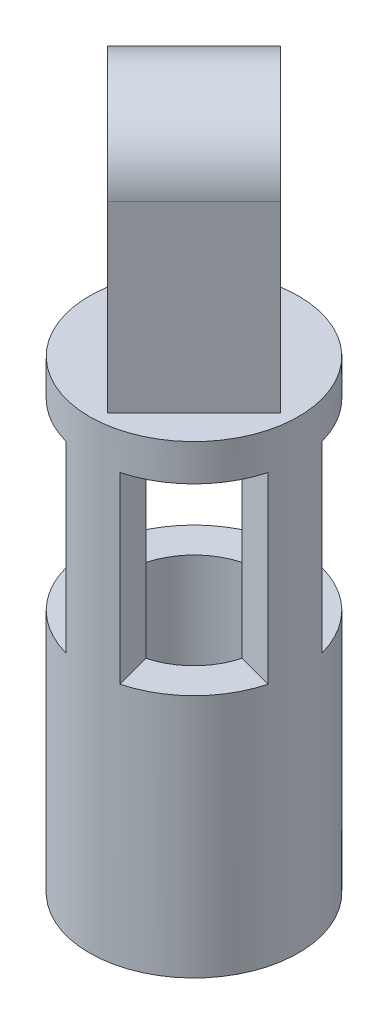
ISO-10303-21;
HEADER;
FILE_DESCRIPTION(('STEP AP214'),'2;1');
FILE_NAME('part.step','',(''),(''),'','','');
FILE_SCHEMA(('AUTOMOTIVE_DESIGN { 1 0 10303 214 1 1 1 1 }'));
ENDSEC;
DATA;
#1=APPLICATION_CONTEXT('core data for automotive mechanical design processes');
#2=APPLICATION_PROTOCOL_DEFINITION('international standard','automotive_design',2000,#1);
#3=PRODUCT_CONTEXT('',#1,'mechanical');
#4=PRODUCT('Part','Part','',(#3));
#5=PRODUCT_RELATED_PRODUCT_CATEGORY('part','',(#4));
#6=PRODUCT_DEFINITION_FORMATION('','',#4);
#7=PRODUCT_DEFINITION_CONTEXT('part definition',#1,'design');
#8=PRODUCT_DEFINITION('design','',#6,#7);
#9=PRODUCT_DEFINITION_SHAPE('','',#8);
#10=(LENGTH_UNIT() NAMED_UNIT(*) SI_UNIT(.MILLI.,.METRE.));
#11=(NAMED_UNIT(*) PLANE_ANGLE_UNIT() SI_UNIT($,.RADIAN.));
#12=(NAMED_UNIT(*) SI_UNIT($,.STERADIAN.) SOLID_ANGLE_UNIT());
#13=UNCERTAINTY_MEASURE_WITH_UNIT(LENGTH_MEASURE(1.E-05),#10,'distance_accuracy_value','');
#14=(GEOMETRIC_REPRESENTATION_CONTEXT(3) GLOBAL_UNCERTAINTY_ASSIGNED_CONTEXT((#13)) GLOBAL_UNIT_ASSIGNED_CONTEXT((#10,
#11,#12)) REPRESENTATION_CONTEXT('',''));
#15=CARTESIAN_POINT('',(0.,0.,0.));
#16=DIRECTION('',(0.,0.,1.));
#17=DIRECTION('',(1.,0.,0.));
#18=AXIS2_PLACEMENT_3D('',#15,#16,#17);
#19=CARTESIAN_POINT('',(0.,38.,0.));
#20=DIRECTION('',(0.,1.,0.));
#21=DIRECTION('',(0.,0.,1.));
#22=AXIS2_PLACEMENT_3D('',#19,#20,#21);
#23=PLANE('',#22);
#24=CARTESIAN_POINT('',(0.,38.,0.));
#25=DIRECTION('',(0.,1.,0.));
#26=DIRECTION('',(0.,0.,1.));
#27=AXIS2_PLACEMENT_3D('',#24,#25,#26);
#28=CIRCLE('',#27,8.55);
#29=CARTESIAN_POINT('',(0.,38.,8.55));
#30=VERTEX_POINT('',#29);
#31=EDGE_CURVE('E212',#30,#30,#28,.T.);
#32=ORIENTED_EDGE('',*,*,#31,.T.);
#33=EDGE_LOOP('',(#32));
#34=FACE_BOUND('',#33,.T.);
#35=DIRECTION('',(0.707106781186547,0.,-0.707106781186548));
#36=VECTOR('',#35,1.);
#37=CARTESIAN_POINT('',(-7.56604255869606,38.,-0.494974746830581));
#38=LINE('',#37,#36);
#39=CARTESIAN_POINT('',(-7.56604255869606,38.,-0.494974746830581));
#40=VERTEX_POINT('',#39);
#41=CARTESIAN_POINT('',(-0.494974746830584,38.,-7.56604255869606));
#42=VERTEX_POINT('',#41);
#43=EDGE_CURVE('E668',#40,#42,#38,.T.);
#44=ORIENTED_EDGE('',*,*,#43,.T.);
#45=DIRECTION('',(0.707106781186548,0.,0.707106781186547));
#46=VECTOR('',#45,1.);
#47=CARTESIAN_POINT('',(3.53553390593274,38.,-3.53553390593274));
#48=LINE('',#47,#46);
#49=CARTESIAN_POINT('',(7.56604255869606,38.,0.494974746830582));
#50=VERTEX_POINT('',#49);
#51=EDGE_CURVE('E201',#42,#50,#48,.T.);
#52=ORIENTED_EDGE('',*,*,#51,.T.);
#53=DIRECTION('',(0.707106781186547,0.,-0.707106781186548));
#54=VECTOR('',#53,1.);
#55=CARTESIAN_POINT('',(0.494974746830584,38.,7.56604255869606));
#56=LINE('',#55,#54);
#57=CARTESIAN_POINT('',(0.494974746830584,38.,7.56604255869606));
#58=VERTEX_POINT('',#57);
#59=EDGE_CURVE('E193',#58,#50,#56,.T.);
#60=ORIENTED_EDGE('',*,*,#59,.F.);
#61=DIRECTION('',(0.707106781186548,0.,0.707106781186547));
#62=VECTOR('',#61,1.);
#63=CARTESIAN_POINT('',(-7.56604255869606,38.,-0.494974746830581));
#64=LINE('',#63,#62);
#65=EDGE_CURVE('E179',#40,#58,#64,.T.);
#66=ORIENTED_EDGE('',*,*,#65,.F.);
#67=EDGE_LOOP('',(#44,#52,#60,#66));
#68=FACE_BOUND('',#67,.T.);
#69=ADVANCED_FACE('F39',(#34,#68),#23,.T.);
#70=CARTESIAN_POINT('',(0.,20.,0.));
#71=DIRECTION('',(0.,1.,0.));
#72=DIRECTION('',(0.,0.,1.));
#73=AXIS2_PLACEMENT_3D('',#70,#71,#72);
#74=PLANE('',#73);
#75=CARTESIAN_POINT('',(0.,20.,0.));
#76=DIRECTION('',(0.,1.,0.));
#77=DIRECTION('',(0.,0.,1.));
#78=AXIS2_PLACEMENT_3D('',#75,#76,#77);
#79=CIRCLE('',#78,8.55);
#80=CARTESIAN_POINT('',(-2.21290283562656,20.,-8.25866581477153));
#81=VERTEX_POINT('',#80);
#82=CARTESIAN_POINT('',(-8.25866581477151,20.,-2.21290283562664));
#83=VERTEX_POINT('',#82);
#84=EDGE_CURVE('E11',#81,#83,#79,.T.);
#85=ORIENTED_EDGE('',*,*,#84,.T.);
#86=DIRECTION('',(-0.965925826289065,0.,-0.258819045102531));
#87=VECTOR('',#86,1.);
#88=CARTESIAN_POINT('',(-8.25866581477151,20.,-2.21290283562664));
#89=LINE('',#88,#87);
#90=CARTESIAN_POINT('',(-5.36088833590431,20.,-1.43644570031905));
#91=VERTEX_POINT('',#90);
#92=EDGE_CURVE('E228',#91,#83,#89,.T.);
#93=ORIENTED_EDGE('',*,*,#92,.F.);
#94=CARTESIAN_POINT('',(0.,20.,0.));
#95=DIRECTION('',(0.,1.,0.));
#96=DIRECTION('',(0.,0.,1.));
#97=AXIS2_PLACEMENT_3D('',#94,#95,#96);
#98=CIRCLE('',#97,5.55);
#99=CARTESIAN_POINT('',(-1.43644570031899,20.,-5.36088833590433));
#100=VERTEX_POINT('',#99);
#101=EDGE_CURVE('E316',#100,#91,#98,.T.);
#102=ORIENTED_EDGE('',*,*,#101,.F.);
#103=DIRECTION('',(0.258819045102521,0.,0.965925826289068));
#104=VECTOR('',#103,1.);
#105=CARTESIAN_POINT('',(-2.21290283562656,20.,-8.25866581477153));
#106=LINE('',#105,#104);
#107=EDGE_CURVE('E293',#81,#100,#106,.T.);
#108=ORIENTED_EDGE('',*,*,#107,.F.);
#109=EDGE_LOOP('',(#85,#93,#102,#108));
#110=FACE_BOUND('',#109,.T.);
#111=ADVANCED_FACE('F367',(#110),#74,.T.);
#112=CARTESIAN_POINT('',(-5.36088833590434,20.,1.43644570031894));
#113=VERTEX_POINT('',#112);
#114=CARTESIAN_POINT('',(-1.43644570031903,20.,5.36088833590432));
#115=VERTEX_POINT('',#114);
#116=EDGE_CURVE('E319',#113,#115,#98,.T.);
#117=ORIENTED_EDGE('',*,*,#116,.F.);
#118=DIRECTION('',(0.965925826289071,0.,-0.258819045102511));
#119=VECTOR('',#118,1.);
#120=CARTESIAN_POINT('',(-8.25866581477156,20.,2.21290283562647));
#121=LINE('',#120,#119);
#122=CARTESIAN_POINT('',(-8.25866581477156,20.,2.21290283562647));
#123=VERTEX_POINT('',#122);
#124=EDGE_CURVE('E226',#123,#113,#121,.T.);
#125=ORIENTED_EDGE('',*,*,#124,.F.);
#126=CARTESIAN_POINT('',(-2.21290283562661,20.,8.25866581477152));
#127=VERTEX_POINT('',#126);
#128=EDGE_CURVE('E48',#123,#127,#79,.T.);
#129=ORIENTED_EDGE('',*,*,#128,.T.);
#130=DIRECTION('',(-0.258819045102528,0.,0.965925826289066));
#131=VECTOR('',#130,1.);
#132=CARTESIAN_POINT('',(-2.21290283562661,20.,8.25866581477152));
#133=LINE('',#132,#131);
#134=EDGE_CURVE('E252',#115,#127,#133,.T.);
#135=ORIENTED_EDGE('',*,*,#134,.F.);
#136=EDGE_LOOP('',(#117,#125,#129,#135));
#137=FACE_BOUND('',#136,.T.);
#138=ADVANCED_FACE('F340',(#137),#74,.T.);
#139=CARTESIAN_POINT('',(1.43644570031896,20.,5.36088833590434));
#140=VERTEX_POINT('',#139);
#141=CARTESIAN_POINT('',(5.36088833590432,20.,1.43644570031901));
#142=VERTEX_POINT('',#141);
#143=EDGE_CURVE('E324',#140,#142,#98,.T.);
#144=ORIENTED_EDGE('',*,*,#143,.F.);
#145=DIRECTION('',(-0.258819045102515,0.,-0.96592582628907));
#146=VECTOR('',#145,1.);
#147=CARTESIAN_POINT('',(2.2129028356265,20.,8.25866581477155));
#148=LINE('',#147,#146);
#149=CARTESIAN_POINT('',(2.2129028356265,20.,8.25866581477155));
#150=VERTEX_POINT('',#149);
#151=EDGE_CURVE('E249',#150,#140,#148,.T.);
#152=ORIENTED_EDGE('',*,*,#151,.F.);
#153=CARTESIAN_POINT('',(8.25866581477153,20.,2.21290283562659));
#154=VERTEX_POINT('',#153);
#155=EDGE_CURVE('E344',#150,#154,#79,.T.);
#156=ORIENTED_EDGE('',*,*,#155,.T.);
#157=DIRECTION('',(0.965925826289067,0.,0.258819045102524));
#158=VECTOR('',#157,1.);
#159=CARTESIAN_POINT('',(8.25866581477153,20.,2.21290283562659));
#160=LINE('',#159,#158);
#161=EDGE_CURVE('E277',#142,#154,#160,.T.);
#162=ORIENTED_EDGE('',*,*,#161,.F.);
#163=EDGE_LOOP('',(#144,#152,#156,#162));
#164=FACE_BOUND('',#163,.T.);
#165=ADVANCED_FACE('F365',(#164),#74,.T.);
#166=CARTESIAN_POINT('',(5.36088833590433,20.,-1.43644570031897));
#167=VERTEX_POINT('',#166);
#168=CARTESIAN_POINT('',(1.43644570031899,20.,-5.36088833590433));
#169=VERTEX_POINT('',#168);
#170=EDGE_CURVE('E320',#167,#169,#98,.T.);
#171=ORIENTED_EDGE('',*,*,#170,.F.);
#172=DIRECTION('',(-0.965925826289069,0.,0.258819045102518));
#173=VECTOR('',#172,1.);
#174=CARTESIAN_POINT('',(8.25866581477154,20.,-2.21290283562653));
#175=LINE('',#174,#173);
#176=CARTESIAN_POINT('',(8.25866581477154,20.,-2.21290283562653));
#177=VERTEX_POINT('',#176);
#178=EDGE_CURVE('E274',#177,#167,#175,.T.);
#179=ORIENTED_EDGE('',*,*,#178,.F.);
#180=CARTESIAN_POINT('',(2.21290283562656,20.,-8.25866581477153));
#181=VERTEX_POINT('',#180);
#182=EDGE_CURVE('E49',#177,#181,#79,.T.);
#183=ORIENTED_EDGE('',*,*,#182,.T.);
#184=DIRECTION('',(0.258819045102521,0.,-0.965925826289068));
#185=VECTOR('',#184,1.);
#186=CARTESIAN_POINT('',(2.21290283562656,20.,-8.25866581477153));
#187=LINE('',#186,#185);
#188=EDGE_CURVE('E281',#169,#181,#187,.T.);
#189=ORIENTED_EDGE('',*,*,#188,.F.);
#190=EDGE_LOOP('',(#171,#179,#183,#189));
#191=FACE_BOUND('',#190,.T.);
#192=ADVANCED_FACE('F359',(#191),#74,.T.);
#193=CARTESIAN_POINT('',(0.,0.,0.));
#194=DIRECTION('',(0.,1.,0.));
#195=DIRECTION('',(0.,0.,1.));
#196=AXIS2_PLACEMENT_3D('',#193,#194,#195);
#197=PLANE('',#196);
#198=CARTESIAN_POINT('',(0.,0.,0.));
#199=DIRECTION('',(0.,1.,0.));
#200=DIRECTION('',(0.,0.,1.));
#201=AXIS2_PLACEMENT_3D('',#198,#199,#200);
#202=CIRCLE('',#201,8.55);
#203=CARTESIAN_POINT('',(0.,0.,8.55));
#204=VERTEX_POINT('',#203);
#205=EDGE_CURVE('E43',#204,#204,#202,.T.);
#206=ORIENTED_EDGE('',*,*,#205,.F.);
#207=EDGE_LOOP('',(#206));
#208=FACE_BOUND('',#207,.T.);
#209=CARTESIAN_POINT('',(0.,0.,0.));
#210=DIRECTION('',(0.,1.,0.));
#211=DIRECTION('',(0.,0.,1.));
#212=AXIS2_PLACEMENT_3D('',#209,#210,#211);
#213=CIRCLE('',#212,5.55);
#214=CARTESIAN_POINT('',(0.,0.,5.55));
#215=VERTEX_POINT('',#214);
#216=EDGE_CURVE('E315',#215,#215,#213,.T.);
#217=ORIENTED_EDGE('',*,*,#216,.T.);
#218=EDGE_LOOP('',(#217));
#219=FACE_BOUND('',#218,.T.);
#220=ADVANCED_FACE('F357',(#208,#219),#197,.F.);
#221=CARTESIAN_POINT('',(0.,20.,0.));
#222=DIRECTION('',(0.,-1.,0.));
#223=DIRECTION('',(0.,0.,-1.));
#224=AXIS2_PLACEMENT_3D('',#221,#222,#223);
#225=CYLINDRICAL_SURFACE('',#224,8.55);
#226=DIRECTION('',(0.,-1.,0.));
#227=VECTOR('',#226,1.);
#228=CARTESIAN_POINT('',(-2.21290283562656,35.,-8.25866581477153));
#229=LINE('',#228,#227);
#230=CARTESIAN_POINT('',(-2.21290283562656,35.,-8.25866581477153));
#231=VERTEX_POINT('',#230);
#232=EDGE_CURVE('E306',#231,#81,#229,.T.);
#233=ORIENTED_EDGE('',*,*,#232,.F.);
#234=CARTESIAN_POINT('',(0.,35.,0.));
#235=DIRECTION('',(0.,1.,0.));
#236=DIRECTION('',(0.,0.,1.));
#237=AXIS2_PLACEMENT_3D('',#234,#235,#236);
#238=CIRCLE('',#237,8.55);
#239=CARTESIAN_POINT('',(-8.25866581477151,35.,-2.21290283562664));
#240=VERTEX_POINT('',#239);
#241=EDGE_CURVE('E205',#231,#240,#238,.T.);
#242=ORIENTED_EDGE('',*,*,#241,.T.);
#243=DIRECTION('',(0.,-1.,0.));
#244=VECTOR('',#243,1.);
#245=CARTESIAN_POINT('',(-8.25866581477151,35.,-2.21290283562664));
#246=LINE('',#245,#244);
#247=EDGE_CURVE('E219',#240,#83,#246,.T.);
#248=ORIENTED_EDGE('',*,*,#247,.T.);
#249=ORIENTED_EDGE('',*,*,#84,.F.);
#250=EDGE_LOOP('',(#233,#242,#248,#249));
#251=FACE_BOUND('',#250,.T.);
#252=DIRECTION('',(0.,-1.,0.));
#253=VECTOR('',#252,1.);
#254=CARTESIAN_POINT('',(8.25866581477154,35.,-2.21290283562653));
#255=LINE('',#254,#253);
#256=CARTESIAN_POINT('',(8.25866581477154,35.,-2.21290283562653));
#257=VERTEX_POINT('',#256);
#258=EDGE_CURVE('E269',#257,#177,#255,.T.);
#259=ORIENTED_EDGE('',*,*,#258,.F.);
#260=CARTESIAN_POINT('',(2.21290283562656,35.,-8.25866581477153));
#261=VERTEX_POINT('',#260);
#262=EDGE_CURVE('E217',#257,#261,#238,.T.);
#263=ORIENTED_EDGE('',*,*,#262,.T.);
#264=DIRECTION('',(0.,-1.,0.));
#265=VECTOR('',#264,1.);
#266=CARTESIAN_POINT('',(2.21290283562656,35.,-8.25866581477153));
#267=LINE('',#266,#265);
#268=EDGE_CURVE('E309',#261,#181,#267,.T.);
#269=ORIENTED_EDGE('',*,*,#268,.T.);
#270=ORIENTED_EDGE('',*,*,#182,.F.);
#271=EDGE_LOOP('',(#259,#263,#269,#270));
#272=FACE_BOUND('',#271,.T.);
#273=DIRECTION('',(0.,-1.,0.));
#274=VECTOR('',#273,1.);
#275=CARTESIAN_POINT('',(2.2129028356265,35.,8.25866581477155));
#276=LINE('',#275,#274);
#277=CARTESIAN_POINT('',(2.2129028356265,35.,8.25866581477155));
#278=VERTEX_POINT('',#277);
#279=EDGE_CURVE('E244',#278,#150,#276,.T.);
#280=ORIENTED_EDGE('',*,*,#279,.F.);
#281=CARTESIAN_POINT('',(8.25866581477153,35.,2.21290283562659));
#282=VERTEX_POINT('',#281);
#283=EDGE_CURVE('E207',#278,#282,#238,.T.);
#284=ORIENTED_EDGE('',*,*,#283,.T.);
#285=DIRECTION('',(0.,-1.,0.));
#286=VECTOR('',#285,1.);
#287=CARTESIAN_POINT('',(8.25866581477153,35.,2.21290283562659));
#288=LINE('',#287,#286);
#289=EDGE_CURVE('E266',#282,#154,#288,.T.);
#290=ORIENTED_EDGE('',*,*,#289,.T.);
#291=ORIENTED_EDGE('',*,*,#155,.F.);
#292=EDGE_LOOP('',(#280,#284,#290,#291));
#293=FACE_BOUND('',#292,.T.);
#294=CARTESIAN_POINT('',(-8.25866581477156,35.,2.21290283562647));
#295=VERTEX_POINT('',#294);
#296=CARTESIAN_POINT('',(-2.21290283562661,35.,8.25866581477152));
#297=VERTEX_POINT('',#296);
#298=EDGE_CURVE('E202',#295,#297,#238,.T.);
#299=ORIENTED_EDGE('',*,*,#298,.T.);
#300=DIRECTION('',(0.,-1.,0.));
#301=VECTOR('',#300,1.);
#302=CARTESIAN_POINT('',(-2.21290283562661,35.,8.25866581477152));
#303=LINE('',#302,#301);
#304=EDGE_CURVE('E241',#297,#127,#303,.T.);
#305=ORIENTED_EDGE('',*,*,#304,.T.);
#306=ORIENTED_EDGE('',*,*,#128,.F.);
#307=DIRECTION('',(0.,-1.,0.));
#308=VECTOR('',#307,1.);
#309=CARTESIAN_POINT('',(-8.25866581477156,35.,2.21290283562647));
#310=LINE('',#309,#308);
#311=EDGE_CURVE('E222',#295,#123,#310,.T.);
#312=ORIENTED_EDGE('',*,*,#311,.F.);
#313=EDGE_LOOP('',(#299,#305,#306,#312));
#314=FACE_BOUND('',#313,.T.);
#315=ORIENTED_EDGE('',*,*,#205,.T.);
#316=EDGE_LOOP('',(#315));
#317=FACE_BOUND('',#316,.T.);
#318=ORIENTED_EDGE('',*,*,#31,.F.);
#319=EDGE_LOOP('',(#318));
#320=FACE_BOUND('',#319,.T.);
#321=ADVANCED_FACE('F41',(#251,#272,#293,#314,#317,#320),#225,.T.);
#322=CARTESIAN_POINT('',(0.,20.,0.));
#323=DIRECTION('',(0.,-1.,0.));
#324=DIRECTION('',(0.,0.,-1.));
#325=AXIS2_PLACEMENT_3D('',#322,#323,#324);
#326=CYLINDRICAL_SURFACE('',#325,5.55);
#327=ORIENTED_EDGE('',*,*,#101,.T.);
#328=DIRECTION('',(0.,-1.,0.));
#329=VECTOR('',#328,1.);
#330=CARTESIAN_POINT('',(-5.36088833590431,35.,-1.43644570031905));
#331=LINE('',#330,#329);
#332=CARTESIAN_POINT('',(-5.36088833590431,35.,-1.43644570031905));
#333=VERTEX_POINT('',#332);
#334=EDGE_CURVE('E214',#333,#91,#331,.T.);
#335=ORIENTED_EDGE('',*,*,#334,.F.);
#336=CARTESIAN_POINT('',(0.,35.,0.));
#337=DIRECTION('',(0.,-1.,0.));
#338=DIRECTION('',(0.,0.,-1.));
#339=AXIS2_PLACEMENT_3D('',#336,#337,#338);
#340=CIRCLE('',#339,5.55);
#341=CARTESIAN_POINT('',(-5.36088833590434,35.,1.43644570031894));
#342=VERTEX_POINT('',#341);
#343=EDGE_CURVE('E229',#342,#333,#340,.T.);
#344=ORIENTED_EDGE('',*,*,#343,.F.);
#345=DIRECTION('',(0.,-1.,0.));
#346=VECTOR('',#345,1.);
#347=CARTESIAN_POINT('',(-5.36088833590434,35.,1.43644570031894));
#348=LINE('',#347,#346);
#349=EDGE_CURVE('E64',#342,#113,#348,.T.);
#350=ORIENTED_EDGE('',*,*,#349,.T.);
#351=ORIENTED_EDGE('',*,*,#116,.T.);
#352=DIRECTION('',(0.,-1.,0.));
#353=VECTOR('',#352,1.);
#354=CARTESIAN_POINT('',(-1.43644570031903,35.,5.36088833590432));
#355=LINE('',#354,#353);
#356=CARTESIAN_POINT('',(-1.43644570031903,35.,5.36088833590432));
#357=VERTEX_POINT('',#356);
#358=EDGE_CURVE('E231',#357,#115,#355,.T.);
#359=ORIENTED_EDGE('',*,*,#358,.F.);
#360=CARTESIAN_POINT('',(0.,35.,0.));
#361=DIRECTION('',(0.,-1.,0.));
#362=DIRECTION('',(0.,0.,-1.));
#363=AXIS2_PLACEMENT_3D('',#360,#361,#362);
#364=CIRCLE('',#363,5.55);
#365=CARTESIAN_POINT('',(1.43644570031896,35.,5.36088833590434));
#366=VERTEX_POINT('',#365);
#367=EDGE_CURVE('E253',#366,#357,#364,.T.);
#368=ORIENTED_EDGE('',*,*,#367,.F.);
#369=DIRECTION('',(0.,-1.,0.));
#370=VECTOR('',#369,1.);
#371=CARTESIAN_POINT('',(1.43644570031896,35.,5.36088833590434));
#372=LINE('',#371,#370);
#373=EDGE_CURVE('E246',#366,#140,#372,.T.);
#374=ORIENTED_EDGE('',*,*,#373,.T.);
#375=ORIENTED_EDGE('',*,*,#143,.T.);
#376=DIRECTION('',(0.,-1.,0.));
#377=VECTOR('',#376,1.);
#378=CARTESIAN_POINT('',(5.36088833590432,35.,1.43644570031901));
#379=LINE('',#378,#377);
#380=CARTESIAN_POINT('',(5.36088833590432,35.,1.43644570031901));
#381=VERTEX_POINT('',#380);
#382=EDGE_CURVE('E256',#381,#142,#379,.T.);
#383=ORIENTED_EDGE('',*,*,#382,.F.);
#384=CARTESIAN_POINT('',(0.,35.,0.));
#385=DIRECTION('',(0.,-1.,0.));
#386=DIRECTION('',(0.,0.,-1.));
#387=AXIS2_PLACEMENT_3D('',#384,#385,#386);
#388=CIRCLE('',#387,5.55);
#389=CARTESIAN_POINT('',(5.36088833590433,35.,-1.43644570031897));
#390=VERTEX_POINT('',#389);
#391=EDGE_CURVE('E278',#390,#381,#388,.T.);
#392=ORIENTED_EDGE('',*,*,#391,.F.);
#393=DIRECTION('',(0.,-1.,0.));
#394=VECTOR('',#393,1.);
#395=CARTESIAN_POINT('',(5.36088833590433,35.,-1.43644570031897));
#396=LINE('',#395,#394);
#397=EDGE_CURVE('E271',#390,#167,#396,.T.);
#398=ORIENTED_EDGE('',*,*,#397,.T.);
#399=ORIENTED_EDGE('',*,*,#170,.T.);
#400=DIRECTION('',(0.,-1.,0.));
#401=VECTOR('',#400,1.);
#402=CARTESIAN_POINT('',(1.43644570031899,35.,-5.36088833590433));
#403=LINE('',#402,#401);
#404=CARTESIAN_POINT('',(1.43644570031899,35.,-5.36088833590433));
#405=VERTEX_POINT('',#404);
#406=EDGE_CURVE('E312',#405,#169,#403,.T.);
#407=ORIENTED_EDGE('',*,*,#406,.F.);
#408=CARTESIAN_POINT('',(0.,35.,0.));
#409=DIRECTION('',(0.,-1.,0.));
#410=DIRECTION('',(0.,0.,-1.));
#411=AXIS2_PLACEMENT_3D('',#408,#409,#410);
#412=CIRCLE('',#411,5.55);
#413=CARTESIAN_POINT('',(-1.43644570031899,35.,-5.36088833590433));
#414=VERTEX_POINT('',#413);
#415=EDGE_CURVE('E289',#414,#405,#412,.T.);
#416=ORIENTED_EDGE('',*,*,#415,.F.);
#417=DIRECTION('',(0.,-1.,0.));
#418=VECTOR('',#417,1.);
#419=CARTESIAN_POINT('',(-1.43644570031899,35.,-5.36088833590433));
#420=LINE('',#419,#418);
#421=EDGE_CURVE('E299',#414,#100,#420,.T.);
#422=ORIENTED_EDGE('',*,*,#421,.T.);
#423=EDGE_LOOP('',(#327,#335,#344,#350,#351,#359,#368,#374,#375,#383,#392,#398,#399,#407,#416,#422));
#424=FACE_BOUND('',#423,.T.);
#425=ORIENTED_EDGE('',*,*,#216,.F.);
#426=EDGE_LOOP('',(#425));
#427=FACE_BOUND('',#426,.T.);
#428=ADVANCED_FACE('F332',(#424,#427),#326,.F.);
#429=CARTESIAN_POINT('',(2.21290283562656,35.,-8.25866581477153));
#430=DIRECTION('',(-0.965925826289068,0.,-0.258819045102521));
#431=DIRECTION('',(-0.258819045102521,0.,0.965925826289068));
#432=AXIS2_PLACEMENT_3D('',#429,#430,#431);
#433=PLANE('',#432);
#434=ORIENTED_EDGE('',*,*,#188,.T.);
#435=ORIENTED_EDGE('',*,*,#268,.F.);
#436=DIRECTION('',(0.258819045102521,0.,-0.965925826289068));
#437=VECTOR('',#436,1.);
#438=CARTESIAN_POINT('',(2.21290283562656,35.,-8.25866581477153));
#439=LINE('',#438,#437);
#440=EDGE_CURVE('E292',#405,#261,#439,.T.);
#441=ORIENTED_EDGE('',*,*,#440,.F.);
#442=ORIENTED_EDGE('',*,*,#406,.T.);
#443=EDGE_LOOP('',(#434,#435,#441,#442));
#444=FACE_BOUND('',#443,.T.);
#445=ADVANCED_FACE('F409',(#444),#433,.F.);
#446=CARTESIAN_POINT('',(-2.21290283562656,35.,-8.25866581477153));
#447=DIRECTION('',(0.965925826289068,0.,-0.258819045102521));
#448=DIRECTION('',(-0.258819045102521,0.,-0.965925826289068));
#449=AXIS2_PLACEMENT_3D('',#446,#447,#448);
#450=PLANE('',#449);
#451=ORIENTED_EDGE('',*,*,#107,.T.);
#452=ORIENTED_EDGE('',*,*,#421,.F.);
#453=DIRECTION('',(0.258819045102521,0.,0.965925826289068));
#454=VECTOR('',#453,1.);
#455=CARTESIAN_POINT('',(-2.21290283562656,35.,-8.25866581477153));
#456=LINE('',#455,#454);
#457=EDGE_CURVE('E296',#231,#414,#456,.T.);
#458=ORIENTED_EDGE('',*,*,#457,.F.);
#459=ORIENTED_EDGE('',*,*,#232,.T.);
#460=EDGE_LOOP('',(#451,#452,#458,#459));
#461=FACE_BOUND('',#460,.T.);
#462=ADVANCED_FACE('F402',(#461),#450,.F.);
#463=CARTESIAN_POINT('',(8.25866581477153,35.,2.21290283562659));
#464=DIRECTION('',(0.258819045102524,0.,-0.965925826289067));
#465=DIRECTION('',(-0.965925826289067,0.,-0.258819045102524));
#466=AXIS2_PLACEMENT_3D('',#463,#464,#465);
#467=PLANE('',#466);
#468=ORIENTED_EDGE('',*,*,#161,.T.);
#469=ORIENTED_EDGE('',*,*,#289,.F.);
#470=DIRECTION('',(0.965925826289067,0.,0.258819045102524));
#471=VECTOR('',#470,1.);
#472=CARTESIAN_POINT('',(8.25866581477153,35.,2.21290283562659));
#473=LINE('',#472,#471);
#474=EDGE_CURVE('E284',#381,#282,#473,.T.);
#475=ORIENTED_EDGE('',*,*,#474,.F.);
#476=ORIENTED_EDGE('',*,*,#382,.T.);
#477=EDGE_LOOP('',(#468,#469,#475,#476));
#478=FACE_BOUND('',#477,.T.);
#479=ADVANCED_FACE('F399',(#478),#467,.F.);
#480=CARTESIAN_POINT('',(8.25866581477154,35.,-2.21290283562653));
#481=DIRECTION('',(0.258819045102518,0.,0.965925826289069));
#482=DIRECTION('',(0.965925826289069,0.,-0.258819045102518));
#483=AXIS2_PLACEMENT_3D('',#480,#481,#482);
#484=PLANE('',#483);
#485=ORIENTED_EDGE('',*,*,#178,.T.);
#486=ORIENTED_EDGE('',*,*,#397,.F.);
#487=DIRECTION('',(-0.965925826289069,0.,0.258819045102518));
#488=VECTOR('',#487,1.);
#489=CARTESIAN_POINT('',(8.25866581477154,35.,-2.21290283562653));
#490=LINE('',#489,#488);
#491=EDGE_CURVE('E273',#257,#390,#490,.T.);
#492=ORIENTED_EDGE('',*,*,#491,.F.);
#493=ORIENTED_EDGE('',*,*,#258,.T.);
#494=EDGE_LOOP('',(#485,#486,#492,#493));
#495=FACE_BOUND('',#494,.T.);
#496=ADVANCED_FACE('F395',(#495),#484,.F.);
#497=CARTESIAN_POINT('',(-2.21290283562661,35.,8.25866581477152));
#498=DIRECTION('',(0.965925826289066,0.,0.258819045102528));
#499=DIRECTION('',(0.258819045102528,0.,-0.965925826289066));
#500=AXIS2_PLACEMENT_3D('',#497,#498,#499);
#501=PLANE('',#500);
#502=ORIENTED_EDGE('',*,*,#134,.T.);
#503=ORIENTED_EDGE('',*,*,#304,.F.);
#504=DIRECTION('',(-0.258819045102528,0.,0.965925826289066));
#505=VECTOR('',#504,1.);
#506=CARTESIAN_POINT('',(-2.21290283562661,35.,8.25866581477152));
#507=LINE('',#506,#505);
#508=EDGE_CURVE('E259',#357,#297,#507,.T.);
#509=ORIENTED_EDGE('',*,*,#508,.F.);
#510=ORIENTED_EDGE('',*,*,#358,.T.);
#511=EDGE_LOOP('',(#502,#503,#509,#510));
#512=FACE_BOUND('',#511,.T.);
#513=ADVANCED_FACE('F339',(#512),#501,.F.);
#514=CARTESIAN_POINT('',(2.2129028356265,35.,8.25866581477155));
#515=DIRECTION('',(-0.96592582628907,0.,0.258819045102515));
#516=DIRECTION('',(0.258819045102515,0.,0.96592582628907));
#517=AXIS2_PLACEMENT_3D('',#514,#515,#516);
#518=PLANE('',#517);
#519=ORIENTED_EDGE('',*,*,#151,.T.);
#520=ORIENTED_EDGE('',*,*,#373,.F.);
#521=DIRECTION('',(-0.258819045102515,0.,-0.96592582628907));
#522=VECTOR('',#521,1.);
#523=CARTESIAN_POINT('',(2.2129028356265,35.,8.25866581477155));
#524=LINE('',#523,#522);
#525=EDGE_CURVE('E248',#278,#366,#524,.T.);
#526=ORIENTED_EDGE('',*,*,#525,.F.);
#527=ORIENTED_EDGE('',*,*,#279,.T.);
#528=EDGE_LOOP('',(#519,#520,#526,#527));
#529=FACE_BOUND('',#528,.T.);
#530=ADVANCED_FACE('F388',(#529),#518,.F.);
#531=CARTESIAN_POINT('',(-8.25866581477151,35.,-2.21290283562664));
#532=DIRECTION('',(-0.258819045102531,0.,0.965925826289065));
#533=DIRECTION('',(0.965925826289066,0.,0.258819045102531));
#534=AXIS2_PLACEMENT_3D('',#531,#532,#533);
#535=PLANE('',#534);
#536=ORIENTED_EDGE('',*,*,#92,.T.);
#537=ORIENTED_EDGE('',*,*,#247,.F.);
#538=DIRECTION('',(-0.965925826289065,0.,-0.258819045102531));
#539=VECTOR('',#538,1.);
#540=CARTESIAN_POINT('',(-8.25866581477151,35.,-2.21290283562664));
#541=LINE('',#540,#539);
#542=EDGE_CURVE('E234',#333,#240,#541,.T.);
#543=ORIENTED_EDGE('',*,*,#542,.F.);
#544=ORIENTED_EDGE('',*,*,#334,.T.);
#545=EDGE_LOOP('',(#536,#537,#543,#544));
#546=FACE_BOUND('',#545,.T.);
#547=ADVANCED_FACE('F385',(#546),#535,.F.);
#548=CARTESIAN_POINT('',(-8.25866581477156,35.,2.21290283562647));
#549=DIRECTION('',(-0.258819045102511,0.,-0.965925826289071));
#550=DIRECTION('',(-0.965925826289071,0.,0.258819045102511));
#551=AXIS2_PLACEMENT_3D('',#548,#549,#550);
#552=PLANE('',#551);
#553=ORIENTED_EDGE('',*,*,#124,.T.);
#554=ORIENTED_EDGE('',*,*,#349,.F.);
#555=DIRECTION('',(0.965925826289071,0.,-0.258819045102511));
#556=VECTOR('',#555,1.);
#557=CARTESIAN_POINT('',(-8.25866581477156,35.,2.21290283562647));
#558=LINE('',#557,#556);
#559=EDGE_CURVE('E225',#295,#342,#558,.T.);
#560=ORIENTED_EDGE('',*,*,#559,.F.);
#561=ORIENTED_EDGE('',*,*,#311,.T.);
#562=EDGE_LOOP('',(#553,#554,#560,#561));
#563=FACE_BOUND('',#562,.T.);
#564=ADVANCED_FACE('F383',(#563),#552,.F.);
#565=CARTESIAN_POINT('',(0.,35.,0.));
#566=DIRECTION('',(0.,1.,0.));
#567=DIRECTION('',(0.,0.,1.));
#568=AXIS2_PLACEMENT_3D('',#565,#566,#567);
#569=PLANE('',#568);
#570=ORIENTED_EDGE('',*,*,#415,.T.);
#571=ORIENTED_EDGE('',*,*,#440,.T.);
#572=ORIENTED_EDGE('',*,*,#262,.F.);
#573=ORIENTED_EDGE('',*,*,#491,.T.);
#574=ORIENTED_EDGE('',*,*,#391,.T.);
#575=ORIENTED_EDGE('',*,*,#474,.T.);
#576=ORIENTED_EDGE('',*,*,#283,.F.);
#577=ORIENTED_EDGE('',*,*,#525,.T.);
#578=ORIENTED_EDGE('',*,*,#367,.T.);
#579=ORIENTED_EDGE('',*,*,#508,.T.);
#580=ORIENTED_EDGE('',*,*,#298,.F.);
#581=ORIENTED_EDGE('',*,*,#559,.T.);
#582=ORIENTED_EDGE('',*,*,#343,.T.);
#583=ORIENTED_EDGE('',*,*,#542,.T.);
#584=ORIENTED_EDGE('',*,*,#241,.F.);
#585=ORIENTED_EDGE('',*,*,#457,.T.);
#586=EDGE_LOOP('',(#570,#571,#572,#573,#574,#575,#576,#577,#578,#579,#580,#581,#582,#583,#584,#585));
#587=FACE_BOUND('',#586,.T.);
#588=ADVANCED_FACE('F380',(#587),#569,.F.);
#589=CARTESIAN_POINT('',(-3.53553390593274,53.,3.53553390593274));
#590=DIRECTION('',(0.707106781186547,0.,-0.707106781186548));
#591=DIRECTION('',(-0.707106781186548,0.,-0.707106781186547));
#592=AXIS2_PLACEMENT_3D('',#589,#590,#591);
#593=PLANE('',#592);
#594=ORIENTED_EDGE('',*,*,#65,.T.);
#595=DIRECTION('',(0.,1.,0.));
#596=VECTOR('',#595,1.);
#597=CARTESIAN_POINT('',(0.494974746830583,53.,7.56604255869606));
#598=LINE('',#597,#596);
#599=CARTESIAN_POINT('',(0.494974746830583,53.,7.56604255869606));
#600=VERTEX_POINT('',#599);
#601=EDGE_CURVE('E183',#58,#600,#598,.T.);
#602=ORIENTED_EDGE('',*,*,#601,.T.);
#603=CARTESIAN_POINT('',(-3.53553390593274,53.,3.53553390593274));
#604=DIRECTION('',(-0.707106781186547,0.,0.707106781186548));
#605=DIRECTION('',(-0.707106781186548,0.,-0.707106781186547));
#606=AXIS2_PLACEMENT_3D('',#603,#604,#605);
#607=CIRCLE('',#606,5.7);
#608=CARTESIAN_POINT('',(-7.56604255869606,53.,-0.494974746830581));
#609=VERTEX_POINT('',#608);
#610=EDGE_CURVE('E198',#600,#609,#607,.T.);
#611=ORIENTED_EDGE('',*,*,#610,.T.);
#612=DIRECTION('',(0.,-1.,0.));
#613=VECTOR('',#612,1.);
#614=CARTESIAN_POINT('',(-7.56604255869606,38.,-0.494974746830581));
#615=LINE('',#614,#613);
#616=EDGE_CURVE('E186',#609,#40,#615,.T.);
#617=ORIENTED_EDGE('',*,*,#616,.T.);
#618=EDGE_LOOP('',(#594,#602,#611,#617));
#619=FACE_BOUND('',#618,.T.);
#620=CARTESIAN_POINT('',(-3.53553390593274,53.,3.53553390593274));
#621=DIRECTION('',(-0.707106781186547,0.,0.707106781186548));
#622=DIRECTION('',(0.707106781186548,0.,0.707106781186547));
#623=AXIS2_PLACEMENT_3D('',#620,#621,#622);
#624=CIRCLE('',#623,2.00000000000001);
#625=CARTESIAN_POINT('',(-2.12132034355964,53.,4.94974746830584));
#626=VERTEX_POINT('',#625);
#627=EDGE_CURVE('E658',#626,#626,#624,.T.);
#628=ORIENTED_EDGE('',*,*,#627,.F.);
#629=EDGE_LOOP('',(#628));
#630=FACE_BOUND('',#629,.T.);
#631=ADVANCED_FACE('F181',(#619,#630),#593,.F.);
#632=CARTESIAN_POINT('',(3.53553390593274,53.,-3.53553390593274));
#633=DIRECTION('',(0.707106781186547,0.,-0.707106781186548));
#634=DIRECTION('',(-0.707106781186548,0.,-0.707106781186547));
#635=AXIS2_PLACEMENT_3D('',#632,#633,#634);
#636=PLANE('',#635);
#637=ORIENTED_EDGE('',*,*,#51,.F.);
#638=DIRECTION('',(0.,-1.,0.));
#639=VECTOR('',#638,1.);
#640=CARTESIAN_POINT('',(-0.494974746830584,38.,-7.56604255869606));
#641=LINE('',#640,#639);
#642=CARTESIAN_POINT('',(-0.494974746830584,53.,-7.56604255869606));
#643=VERTEX_POINT('',#642);
#644=EDGE_CURVE('E56',#643,#42,#641,.T.);
#645=ORIENTED_EDGE('',*,*,#644,.F.);
#646=CARTESIAN_POINT('',(3.53553390593274,53.,-3.53553390593274));
#647=DIRECTION('',(-0.707106781186547,0.,0.707106781186548));
#648=DIRECTION('',(-0.707106781186548,0.,-0.707106781186547));
#649=AXIS2_PLACEMENT_3D('',#646,#647,#648);
#650=CIRCLE('',#649,5.7);
#651=CARTESIAN_POINT('',(7.56604255869606,53.,0.494974746830581));
#652=VERTEX_POINT('',#651);
#653=EDGE_CURVE('E672',#652,#643,#650,.T.);
#654=ORIENTED_EDGE('',*,*,#653,.F.);
#655=DIRECTION('',(0.,1.,0.));
#656=VECTOR('',#655,1.);
#657=CARTESIAN_POINT('',(7.56604255869606,53.,0.49497474683058));
#658=LINE('',#657,#656);
#659=EDGE_CURVE('E670',#50,#652,#658,.T.);
#660=ORIENTED_EDGE('',*,*,#659,.F.);
#661=EDGE_LOOP('',(#637,#645,#654,#660));
#662=FACE_BOUND('',#661,.T.);
#663=CARTESIAN_POINT('',(3.53553390593274,53.,-3.53553390593274));
#664=DIRECTION('',(-0.707106781186547,0.,0.707106781186548));
#665=DIRECTION('',(0.707106781186548,0.,0.707106781186547));
#666=AXIS2_PLACEMENT_3D('',#663,#664,#665);
#667=CIRCLE('',#666,2.00000000000001);
#668=CARTESIAN_POINT('',(4.94974746830584,53.,-2.12132034355964));
#669=VERTEX_POINT('',#668);
#670=EDGE_CURVE('E661',#669,#669,#667,.T.);
#671=ORIENTED_EDGE('',*,*,#670,.T.);
#672=EDGE_LOOP('',(#671));
#673=FACE_BOUND('',#672,.T.);
#674=ADVANCED_FACE('F465',(#662,#673),#636,.T.);
#675=CARTESIAN_POINT('',(0.494974746830583,53.,7.56604255869606));
#676=DIRECTION('',(-0.707106781186548,0.,-0.707106781186547));
#677=DIRECTION('',(-0.707106781186547,0.,0.707106781186548));
#678=AXIS2_PLACEMENT_3D('',#675,#676,#677);
#679=PLANE('',#678);
#680=ORIENTED_EDGE('',*,*,#659,.T.);
#681=DIRECTION('',(0.707106781186547,0.,-0.707106781186548));
#682=VECTOR('',#681,1.);
#683=CARTESIAN_POINT('',(0.494974746830583,53.,7.56604255869606));
#684=LINE('',#683,#682);
#685=EDGE_CURVE('E196',#600,#652,#684,.T.);
#686=ORIENTED_EDGE('',*,*,#685,.F.);
#687=ORIENTED_EDGE('',*,*,#601,.F.);
#688=ORIENTED_EDGE('',*,*,#59,.T.);
#689=EDGE_LOOP('',(#680,#686,#687,#688));
#690=FACE_BOUND('',#689,.T.);
#691=ADVANCED_FACE('F192',(#690),#679,.F.);
#692=CARTESIAN_POINT('',(-3.53553390593274,53.,3.53553390593274));
#693=DIRECTION('',(0.707106781186547,0.,-0.707106781186548));
#694=DIRECTION('',(-0.707106781186548,0.,-0.707106781186547));
#695=AXIS2_PLACEMENT_3D('',#692,#693,#694);
#696=CYLINDRICAL_SURFACE('',#695,5.7);
#697=ORIENTED_EDGE('',*,*,#653,.T.);
#698=DIRECTION('',(0.707106781186547,0.,-0.707106781186548));
#699=VECTOR('',#698,1.);
#700=CARTESIAN_POINT('',(-7.56604255869606,53.,-0.494974746830581));
#701=LINE('',#700,#699);
#702=EDGE_CURVE('E208',#609,#643,#701,.T.);
#703=ORIENTED_EDGE('',*,*,#702,.F.);
#704=ORIENTED_EDGE('',*,*,#610,.F.);
#705=ORIENTED_EDGE('',*,*,#685,.T.);
#706=EDGE_LOOP('',(#697,#703,#704,#705));
#707=FACE_BOUND('',#706,.T.);
#708=ADVANCED_FACE('F478',(#707),#696,.T.);
#709=CARTESIAN_POINT('',(-7.56604255869606,38.,-0.494974746830581));
#710=DIRECTION('',(0.707106781186548,0.,0.707106781186547));
#711=DIRECTION('',(0.707106781186547,0.,-0.707106781186548));
#712=AXIS2_PLACEMENT_3D('',#709,#710,#711);
#713=PLANE('',#712);
#714=ORIENTED_EDGE('',*,*,#644,.T.);
#715=ORIENTED_EDGE('',*,*,#43,.F.);
#716=ORIENTED_EDGE('',*,*,#616,.F.);
#717=ORIENTED_EDGE('',*,*,#702,.T.);
#718=EDGE_LOOP('',(#714,#715,#716,#717));
#719=FACE_BOUND('',#718,.T.);
#720=ADVANCED_FACE('F484',(#719),#713,.F.);
#721=CARTESIAN_POINT('',(-3.53553390593274,53.,3.53553390593274));
#722=DIRECTION('',(0.707106781186547,0.,-0.707106781186548));
#723=DIRECTION('',(-0.707106781186548,0.,-0.707106781186547));
#724=AXIS2_PLACEMENT_3D('',#721,#722,#723);
#725=CYLINDRICAL_SURFACE('',#724,2.00000000000001);
#726=ORIENTED_EDGE('',*,*,#627,.T.);
#727=EDGE_LOOP('',(#726));
#728=FACE_BOUND('',#727,.T.);
#729=ORIENTED_EDGE('',*,*,#670,.F.);
#730=EDGE_LOOP('',(#729));
#731=FACE_BOUND('',#730,.T.);
#732=ADVANCED_FACE('F491',(#728,#731),#725,.F.);
#733=CLOSED_SHELL('',(#69,#111,#138,#165,#192,#220,#321,#428,#445,#462,#479,#496,#513,#530,#547,
#564,#588,#631,#674,#691,#708,#720,#732));
#734=MANIFOLD_SOLID_BREP('B2',#733);
#735=ADVANCED_BREP_SHAPE_REPRESENTATION('',(#18,#734),#14);
#736=SHAPE_DEFINITION_REPRESENTATION(#9,#735);
ENDSEC;
END-ISO-10303-21;
